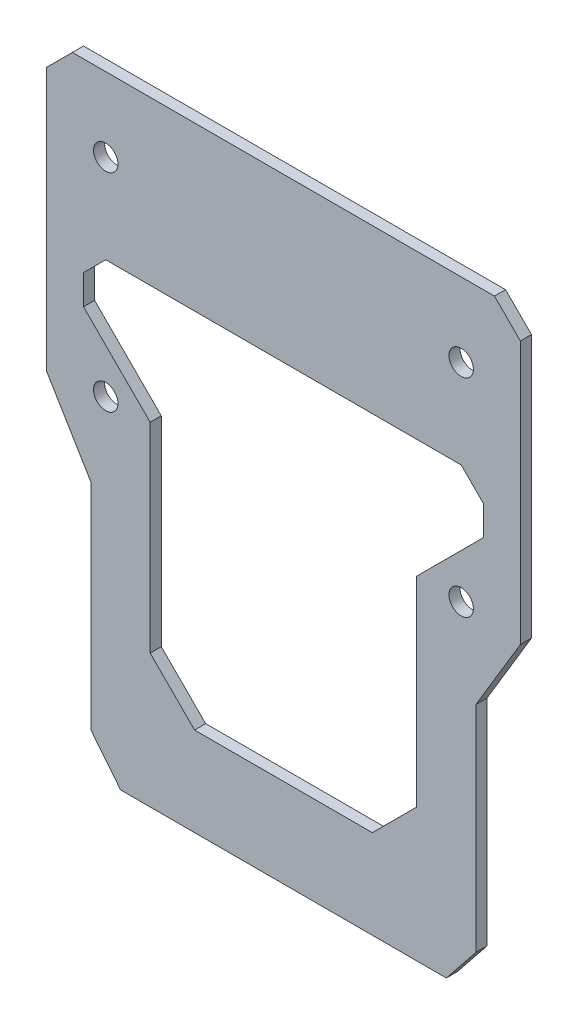
ISO-10303-21;
HEADER;
FILE_DESCRIPTION(('STEP AP214'),'2;1');
FILE_NAME('part.step','',(''),(''),'','','');
FILE_SCHEMA(('AUTOMOTIVE_DESIGN { 1 0 10303 214 1 1 1 1 }'));
ENDSEC;
DATA;
#1=APPLICATION_CONTEXT('core data for automotive mechanical design processes');
#2=APPLICATION_PROTOCOL_DEFINITION('international standard','automotive_design',2000,#1);
#3=PRODUCT_CONTEXT('',#1,'mechanical');
#4=PRODUCT('Part','Part','',(#3));
#5=PRODUCT_RELATED_PRODUCT_CATEGORY('part','',(#4));
#6=PRODUCT_DEFINITION_FORMATION('','',#4);
#7=PRODUCT_DEFINITION_CONTEXT('part definition',#1,'design');
#8=PRODUCT_DEFINITION('design','',#6,#7);
#9=PRODUCT_DEFINITION_SHAPE('','',#8);
#10=(LENGTH_UNIT() NAMED_UNIT(*) SI_UNIT(.MILLI.,.METRE.));
#11=(NAMED_UNIT(*) PLANE_ANGLE_UNIT() SI_UNIT($,.RADIAN.));
#12=(NAMED_UNIT(*) SI_UNIT($,.STERADIAN.) SOLID_ANGLE_UNIT());
#13=UNCERTAINTY_MEASURE_WITH_UNIT(LENGTH_MEASURE(1.E-05),#10,'distance_accuracy_value','');
#14=(GEOMETRIC_REPRESENTATION_CONTEXT(3) GLOBAL_UNCERTAINTY_ASSIGNED_CONTEXT((#13)) GLOBAL_UNIT_ASSIGNED_CONTEXT((#10,
#11,#12)) REPRESENTATION_CONTEXT('',''));
#15=CARTESIAN_POINT('',(0.,0.,0.));
#16=DIRECTION('',(0.,0.,1.));
#17=DIRECTION('',(1.,0.,0.));
#18=AXIS2_PLACEMENT_3D('',#15,#16,#17);
#19=CARTESIAN_POINT('',(0.,0.,1.5));
#20=DIRECTION('',(0.,0.,-1.));
#21=DIRECTION('',(-1.,0.,0.));
#22=AXIS2_PLACEMENT_3D('',#19,#20,#21);
#23=PLANE('',#22);
#24=CARTESIAN_POINT('',(24.,73.,1.5));
#25=DIRECTION('',(0.,0.,1.));
#26=DIRECTION('',(1.,0.,0.));
#27=AXIS2_PLACEMENT_3D('',#24,#25,#26);
#28=CIRCLE('',#27,1.65);
#29=CARTESIAN_POINT('',(25.65,73.,1.5));
#30=VERTEX_POINT('',#29);
#31=EDGE_CURVE('E550',#30,#30,#28,.T.);
#32=ORIENTED_EDGE('',*,*,#31,.F.);
#33=EDGE_LOOP('',(#32));
#34=FACE_BOUND('',#33,.T.);
#35=CARTESIAN_POINT('',(-24.,73.,1.5));
#36=DIRECTION('',(0.,0.,1.));
#37=DIRECTION('',(1.,0.,0.));
#38=AXIS2_PLACEMENT_3D('',#35,#36,#37);
#39=CIRCLE('',#38,1.65);
#40=CARTESIAN_POINT('',(-22.35,73.,1.5));
#41=VERTEX_POINT('',#40);
#42=EDGE_CURVE('E565',#41,#41,#39,.T.);
#43=ORIENTED_EDGE('',*,*,#42,.F.);
#44=EDGE_LOOP('',(#43));
#45=FACE_BOUND('',#44,.T.);
#46=CARTESIAN_POINT('',(24.,45.,1.5));
#47=DIRECTION('',(0.,0.,1.));
#48=DIRECTION('',(1.,0.,0.));
#49=AXIS2_PLACEMENT_3D('',#46,#47,#48);
#50=CIRCLE('',#49,1.65);
#51=CARTESIAN_POINT('',(25.65,45.,1.5));
#52=VERTEX_POINT('',#51);
#53=EDGE_CURVE('E574',#52,#52,#50,.T.);
#54=ORIENTED_EDGE('',*,*,#53,.F.);
#55=EDGE_LOOP('',(#54));
#56=FACE_BOUND('',#55,.T.);
#57=CARTESIAN_POINT('',(-24.,45.,1.5));
#58=DIRECTION('',(0.,0.,1.));
#59=DIRECTION('',(1.,0.,0.));
#60=AXIS2_PLACEMENT_3D('',#57,#58,#59);
#61=CIRCLE('',#60,1.65);
#62=CARTESIAN_POINT('',(-22.35,45.,1.5));
#63=VERTEX_POINT('',#62);
#64=EDGE_CURVE('E432',#63,#63,#61,.T.);
#65=ORIENTED_EDGE('',*,*,#64,.F.);
#66=EDGE_LOOP('',(#65));
#67=FACE_BOUND('',#66,.T.);
#68=DIRECTION('',(-0.707106781186548,-0.707106781186547,0.));
#69=VECTOR('',#68,1.);
#70=CARTESIAN_POINT('',(-27.,58.,1.5));
#71=LINE('',#70,#69);
#72=CARTESIAN_POINT('',(-24.,61.,1.5));
#73=VERTEX_POINT('',#72);
#74=CARTESIAN_POINT('',(-27.,58.,1.5));
#75=VERTEX_POINT('',#74);
#76=EDGE_CURVE('E399',#73,#75,#71,.T.);
#77=ORIENTED_EDGE('',*,*,#76,.F.);
#78=DIRECTION('',(-1.,0.,0.));
#79=VECTOR('',#78,1.);
#80=CARTESIAN_POINT('',(-24.,61.,1.5));
#81=LINE('',#80,#79);
#82=CARTESIAN_POINT('',(24.,61.,1.5));
#83=VERTEX_POINT('',#82);
#84=EDGE_CURVE('E418',#83,#73,#81,.T.);
#85=ORIENTED_EDGE('',*,*,#84,.F.);
#86=DIRECTION('',(-0.707106781186548,0.707106781186547,0.));
#87=VECTOR('',#86,1.);
#88=CARTESIAN_POINT('',(24.,61.,1.5));
#89=LINE('',#88,#87);
#90=CARTESIAN_POINT('',(27.,58.,1.5));
#91=VERTEX_POINT('',#90);
#92=EDGE_CURVE('E423',#91,#83,#89,.T.);
#93=ORIENTED_EDGE('',*,*,#92,.F.);
#94=DIRECTION('',(0.,1.,0.));
#95=VECTOR('',#94,1.);
#96=CARTESIAN_POINT('',(27.,58.,1.5));
#97=LINE('',#96,#95);
#98=CARTESIAN_POINT('',(27.,54.,1.5));
#99=VERTEX_POINT('',#98);
#100=EDGE_CURVE('E1009',#99,#91,#97,.T.);
#101=ORIENTED_EDGE('',*,*,#100,.F.);
#102=DIRECTION('',(0.707106781186547,0.707106781186547,0.));
#103=VECTOR('',#102,1.);
#104=CARTESIAN_POINT('',(27.,54.,1.5));
#105=LINE('',#104,#103);
#106=CARTESIAN_POINT('',(18.,45.,1.5));
#107=VERTEX_POINT('',#106);
#108=EDGE_CURVE('E1005',#107,#99,#105,.T.);
#109=ORIENTED_EDGE('',*,*,#108,.F.);
#110=DIRECTION('',(0.,1.,0.));
#111=VECTOR('',#110,1.);
#112=CARTESIAN_POINT('',(18.,45.,1.5));
#113=LINE('',#112,#111);
#114=CARTESIAN_POINT('',(18.,18.,1.5));
#115=VERTEX_POINT('',#114);
#116=EDGE_CURVE('E1001',#115,#107,#113,.T.);
#117=ORIENTED_EDGE('',*,*,#116,.F.);
#118=DIRECTION('',(0.707106781186548,0.707106781186548,0.));
#119=VECTOR('',#118,1.);
#120=CARTESIAN_POINT('',(18.,18.,1.5));
#121=LINE('',#120,#119);
#122=CARTESIAN_POINT('',(12.,12.,1.5));
#123=VERTEX_POINT('',#122);
#124=EDGE_CURVE('E1027',#123,#115,#121,.T.);
#125=ORIENTED_EDGE('',*,*,#124,.F.);
#126=DIRECTION('',(1.,0.,0.));
#127=VECTOR('',#126,1.);
#128=CARTESIAN_POINT('',(12.,12.,1.5));
#129=LINE('',#128,#127);
#130=CARTESIAN_POINT('',(-12.,12.,1.5));
#131=VERTEX_POINT('',#130);
#132=EDGE_CURVE('E994',#131,#123,#129,.T.);
#133=ORIENTED_EDGE('',*,*,#132,.F.);
#134=DIRECTION('',(0.707106781186548,-0.707106781186548,0.));
#135=VECTOR('',#134,1.);
#136=CARTESIAN_POINT('',(-12.,12.,1.5));
#137=LINE('',#136,#135);
#138=CARTESIAN_POINT('',(-18.,18.,1.5));
#139=VERTEX_POINT('',#138);
#140=EDGE_CURVE('E533',#139,#131,#137,.T.);
#141=ORIENTED_EDGE('',*,*,#140,.F.);
#142=DIRECTION('',(0.,-1.,0.));
#143=VECTOR('',#142,1.);
#144=CARTESIAN_POINT('',(-18.,18.,1.5));
#145=LINE('',#144,#143);
#146=CARTESIAN_POINT('',(-18.,45.,1.5));
#147=VERTEX_POINT('',#146);
#148=EDGE_CURVE('E530',#147,#139,#145,.T.);
#149=ORIENTED_EDGE('',*,*,#148,.F.);
#150=DIRECTION('',(0.707106781186547,-0.707106781186547,0.));
#151=VECTOR('',#150,1.);
#152=CARTESIAN_POINT('',(-18.,45.,1.5));
#153=LINE('',#152,#151);
#154=CARTESIAN_POINT('',(-27.,54.,1.5));
#155=VERTEX_POINT('',#154);
#156=EDGE_CURVE('E525',#155,#147,#153,.T.);
#157=ORIENTED_EDGE('',*,*,#156,.F.);
#158=DIRECTION('',(0.,-1.,0.));
#159=VECTOR('',#158,1.);
#160=CARTESIAN_POINT('',(-27.,54.,1.5));
#161=LINE('',#160,#159);
#162=EDGE_CURVE('E404',#75,#155,#161,.T.);
#163=ORIENTED_EDGE('',*,*,#162,.F.);
#164=EDGE_LOOP('',(#77,#85,#93,#101,#109,#117,#125,#133,#141,#149,#157,#163));
#165=FACE_BOUND('',#164,.T.);
#166=DIRECTION('',(1.,0.,0.));
#167=VECTOR('',#166,1.);
#168=CARTESIAN_POINT('',(-100.,83.,1.5));
#169=LINE('',#168,#167);
#170=CARTESIAN_POINT('',(-28.5,83.,1.5));
#171=VERTEX_POINT('',#170);
#172=CARTESIAN_POINT('',(28.5,83.,1.5));
#173=VERTEX_POINT('',#172);
#174=EDGE_CURVE('E211',#171,#173,#169,.T.);
#175=ORIENTED_EDGE('',*,*,#174,.F.);
#176=DIRECTION('',(-0.707106781186547,-0.707106781186548,0.));
#177=VECTOR('',#176,1.);
#178=CARTESIAN_POINT('',(-28.,83.5,1.5));
#179=LINE('',#178,#177);
#180=CARTESIAN_POINT('',(-32.,79.5,1.5));
#181=VERTEX_POINT('',#180);
#182=EDGE_CURVE('E346',#171,#181,#179,.T.);
#183=ORIENTED_EDGE('',*,*,#182,.T.);
#184=DIRECTION('',(0.,-1.,0.));
#185=VECTOR('',#184,1.);
#186=CARTESIAN_POINT('',(-32.,79.5,1.5));
#187=LINE('',#186,#185);
#188=CARTESIAN_POINT('',(-32.,44.,1.5));
#189=VERTEX_POINT('',#188);
#190=EDGE_CURVE('E387',#181,#189,#187,.T.);
#191=ORIENTED_EDGE('',*,*,#190,.T.);
#192=DIRECTION('',(0.514495755427527,-0.857492925712544,0.));
#193=VECTOR('',#192,1.);
#194=CARTESIAN_POINT('',(-32.,44.,1.5));
#195=LINE('',#194,#193);
#196=CARTESIAN_POINT('',(-26.,34.,1.5));
#197=VERTEX_POINT('',#196);
#198=EDGE_CURVE('E384',#189,#197,#195,.T.);
#199=ORIENTED_EDGE('',*,*,#198,.T.);
#200=DIRECTION('',(0.,-1.,0.));
#201=VECTOR('',#200,1.);
#202=CARTESIAN_POINT('',(-26.,34.,1.5));
#203=LINE('',#202,#201);
#204=CARTESIAN_POINT('',(-26.,5.,1.5));
#205=VERTEX_POINT('',#204);
#206=EDGE_CURVE('E260',#197,#205,#203,.T.);
#207=ORIENTED_EDGE('',*,*,#206,.T.);
#208=DIRECTION('',(0.624695047554424,-0.78086880944303,0.));
#209=VECTOR('',#208,1.);
#210=CARTESIAN_POINT('',(-26.,5.,1.5));
#211=LINE('',#210,#209);
#212=CARTESIAN_POINT('',(-22.,0.,1.5));
#213=VERTEX_POINT('',#212);
#214=EDGE_CURVE('E254',#205,#213,#211,.T.);
#215=ORIENTED_EDGE('',*,*,#214,.T.);
#216=DIRECTION('',(1.,0.,0.));
#217=VECTOR('',#216,1.);
#218=CARTESIAN_POINT('',(-22.,0.,1.5));
#219=LINE('',#218,#217);
#220=CARTESIAN_POINT('',(22.,0.,1.5));
#221=VERTEX_POINT('',#220);
#222=EDGE_CURVE('E299',#213,#221,#219,.T.);
#223=ORIENTED_EDGE('',*,*,#222,.T.);
#224=DIRECTION('',(0.624695047554424,0.78086880944303,0.));
#225=VECTOR('',#224,1.);
#226=CARTESIAN_POINT('',(22.,0.,1.5));
#227=LINE('',#226,#225);
#228=CARTESIAN_POINT('',(26.,5.,1.5));
#229=VERTEX_POINT('',#228);
#230=EDGE_CURVE('E365',#221,#229,#227,.T.);
#231=ORIENTED_EDGE('',*,*,#230,.T.);
#232=DIRECTION('',(0.,1.,0.));
#233=VECTOR('',#232,1.);
#234=CARTESIAN_POINT('',(26.,5.,1.5));
#235=LINE('',#234,#233);
#236=CARTESIAN_POINT('',(26.,34.,1.5));
#237=VERTEX_POINT('',#236);
#238=EDGE_CURVE('E347',#229,#237,#235,.T.);
#239=ORIENTED_EDGE('',*,*,#238,.T.);
#240=DIRECTION('',(0.514495755427527,0.857492925712544,0.));
#241=VECTOR('',#240,1.);
#242=CARTESIAN_POINT('',(26.,34.,1.5));
#243=LINE('',#242,#241);
#244=CARTESIAN_POINT('',(32.,44.,1.5));
#245=VERTEX_POINT('',#244);
#246=EDGE_CURVE('E341',#237,#245,#243,.T.);
#247=ORIENTED_EDGE('',*,*,#246,.T.);
#248=DIRECTION('',(0.,1.,0.));
#249=VECTOR('',#248,1.);
#250=CARTESIAN_POINT('',(32.,44.,1.5));
#251=LINE('',#250,#249);
#252=CARTESIAN_POINT('',(32.,79.5,1.5));
#253=VERTEX_POINT('',#252);
#254=EDGE_CURVE('E337',#245,#253,#251,.T.);
#255=ORIENTED_EDGE('',*,*,#254,.T.);
#256=DIRECTION('',(-0.707106781186547,0.707106781186548,0.));
#257=VECTOR('',#256,1.);
#258=CARTESIAN_POINT('',(32.,79.5,1.5));
#259=LINE('',#258,#257);
#260=EDGE_CURVE('E340',#253,#173,#259,.T.);
#261=ORIENTED_EDGE('',*,*,#260,.T.);
#262=EDGE_LOOP('',(#175,#183,#191,#199,#207,#215,#223,#231,#239,#247,#255,#261));
#263=FACE_BOUND('',#262,.T.);
#264=ADVANCED_FACE('F49',(#34,#45,#56,#67,#165,#263),#23,.F.);
#265=CARTESIAN_POINT('',(0.,0.,0.));
#266=DIRECTION('',(0.,0.,-1.));
#267=DIRECTION('',(-1.,0.,0.));
#268=AXIS2_PLACEMENT_3D('',#265,#266,#267);
#269=PLANE('',#268);
#270=CARTESIAN_POINT('',(-24.,73.,0.));
#271=DIRECTION('',(0.,0.,1.));
#272=DIRECTION('',(1.,0.,0.));
#273=AXIS2_PLACEMENT_3D('',#270,#271,#272);
#274=CIRCLE('',#273,1.65);
#275=CARTESIAN_POINT('',(-22.35,73.,0.));
#276=VERTEX_POINT('',#275);
#277=EDGE_CURVE('E555',#276,#276,#274,.T.);
#278=ORIENTED_EDGE('',*,*,#277,.T.);
#279=EDGE_LOOP('',(#278));
#280=FACE_BOUND('',#279,.T.);
#281=CARTESIAN_POINT('',(-24.,45.,0.));
#282=DIRECTION('',(0.,0.,1.));
#283=DIRECTION('',(1.,0.,0.));
#284=AXIS2_PLACEMENT_3D('',#281,#282,#283);
#285=CIRCLE('',#284,1.65);
#286=CARTESIAN_POINT('',(-22.35,45.,0.));
#287=VERTEX_POINT('',#286);
#288=EDGE_CURVE('E406',#287,#287,#285,.T.);
#289=ORIENTED_EDGE('',*,*,#288,.T.);
#290=EDGE_LOOP('',(#289));
#291=FACE_BOUND('',#290,.T.);
#292=DIRECTION('',(-1.,0.,0.));
#293=VECTOR('',#292,1.);
#294=CARTESIAN_POINT('',(-24.,61.,0.));
#295=LINE('',#294,#293);
#296=CARTESIAN_POINT('',(24.,61.,0.));
#297=VERTEX_POINT('',#296);
#298=CARTESIAN_POINT('',(-24.,61.,0.));
#299=VERTEX_POINT('',#298);
#300=EDGE_CURVE('E405',#297,#299,#295,.T.);
#301=ORIENTED_EDGE('',*,*,#300,.T.);
#302=DIRECTION('',(-0.707106781186548,-0.707106781186547,0.));
#303=VECTOR('',#302,1.);
#304=CARTESIAN_POINT('',(-27.,58.,0.));
#305=LINE('',#304,#303);
#306=CARTESIAN_POINT('',(-27.,58.,0.));
#307=VERTEX_POINT('',#306);
#308=EDGE_CURVE('E426',#299,#307,#305,.T.);
#309=ORIENTED_EDGE('',*,*,#308,.T.);
#310=DIRECTION('',(0.,-1.,0.));
#311=VECTOR('',#310,1.);
#312=CARTESIAN_POINT('',(-27.,54.,0.));
#313=LINE('',#312,#311);
#314=CARTESIAN_POINT('',(-27.,54.,0.));
#315=VERTEX_POINT('',#314);
#316=EDGE_CURVE('E431',#307,#315,#313,.T.);
#317=ORIENTED_EDGE('',*,*,#316,.T.);
#318=DIRECTION('',(0.707106781186547,-0.707106781186547,0.));
#319=VECTOR('',#318,1.);
#320=CARTESIAN_POINT('',(-18.,45.,0.));
#321=LINE('',#320,#319);
#322=CARTESIAN_POINT('',(-18.,45.,0.));
#323=VERTEX_POINT('',#322);
#324=EDGE_CURVE('E436',#315,#323,#321,.T.);
#325=ORIENTED_EDGE('',*,*,#324,.T.);
#326=DIRECTION('',(0.,-1.,0.));
#327=VECTOR('',#326,1.);
#328=CARTESIAN_POINT('',(-18.,18.,0.));
#329=LINE('',#328,#327);
#330=CARTESIAN_POINT('',(-18.,18.,0.));
#331=VERTEX_POINT('',#330);
#332=EDGE_CURVE('E440',#323,#331,#329,.T.);
#333=ORIENTED_EDGE('',*,*,#332,.T.);
#334=DIRECTION('',(0.707106781186548,-0.707106781186548,0.));
#335=VECTOR('',#334,1.);
#336=CARTESIAN_POINT('',(-12.,12.,0.));
#337=LINE('',#336,#335);
#338=CARTESIAN_POINT('',(-12.,12.,0.));
#339=VERTEX_POINT('',#338);
#340=EDGE_CURVE('E444',#331,#339,#337,.T.);
#341=ORIENTED_EDGE('',*,*,#340,.T.);
#342=DIRECTION('',(1.,0.,0.));
#343=VECTOR('',#342,1.);
#344=CARTESIAN_POINT('',(12.,12.,0.));
#345=LINE('',#344,#343);
#346=CARTESIAN_POINT('',(12.,12.,0.));
#347=VERTEX_POINT('',#346);
#348=EDGE_CURVE('E448',#339,#347,#345,.T.);
#349=ORIENTED_EDGE('',*,*,#348,.T.);
#350=DIRECTION('',(0.707106781186548,0.707106781186548,0.));
#351=VECTOR('',#350,1.);
#352=CARTESIAN_POINT('',(18.,18.,0.));
#353=LINE('',#352,#351);
#354=CARTESIAN_POINT('',(18.,18.,0.));
#355=VERTEX_POINT('',#354);
#356=EDGE_CURVE('E452',#347,#355,#353,.T.);
#357=ORIENTED_EDGE('',*,*,#356,.T.);
#358=DIRECTION('',(0.,1.,0.));
#359=VECTOR('',#358,1.);
#360=CARTESIAN_POINT('',(18.,45.,0.));
#361=LINE('',#360,#359);
#362=CARTESIAN_POINT('',(18.,45.,0.));
#363=VERTEX_POINT('',#362);
#364=EDGE_CURVE('E456',#355,#363,#361,.T.);
#365=ORIENTED_EDGE('',*,*,#364,.T.);
#366=DIRECTION('',(0.707106781186547,0.707106781186547,0.));
#367=VECTOR('',#366,1.);
#368=CARTESIAN_POINT('',(27.,54.,0.));
#369=LINE('',#368,#367);
#370=CARTESIAN_POINT('',(27.,54.,0.));
#371=VERTEX_POINT('',#370);
#372=EDGE_CURVE('E460',#363,#371,#369,.T.);
#373=ORIENTED_EDGE('',*,*,#372,.T.);
#374=DIRECTION('',(0.,1.,0.));
#375=VECTOR('',#374,1.);
#376=CARTESIAN_POINT('',(27.,58.,0.));
#377=LINE('',#376,#375);
#378=CARTESIAN_POINT('',(27.,58.,0.));
#379=VERTEX_POINT('',#378);
#380=EDGE_CURVE('E464',#371,#379,#377,.T.);
#381=ORIENTED_EDGE('',*,*,#380,.T.);
#382=DIRECTION('',(-0.707106781186548,0.707106781186547,0.));
#383=VECTOR('',#382,1.);
#384=CARTESIAN_POINT('',(24.,61.,0.));
#385=LINE('',#384,#383);
#386=EDGE_CURVE('E467',#379,#297,#385,.T.);
#387=ORIENTED_EDGE('',*,*,#386,.T.);
#388=EDGE_LOOP('',(#301,#309,#317,#325,#333,#341,#349,#357,#365,#373,#381,#387));
#389=FACE_BOUND('',#388,.T.);
#390=CARTESIAN_POINT('',(24.,45.,0.));
#391=DIRECTION('',(0.,0.,1.));
#392=DIRECTION('',(1.,0.,0.));
#393=AXIS2_PLACEMENT_3D('',#390,#391,#392);
#394=CIRCLE('',#393,1.65);
#395=CARTESIAN_POINT('',(25.65,45.,0.));
#396=VERTEX_POINT('',#395);
#397=EDGE_CURVE('E570',#396,#396,#394,.T.);
#398=ORIENTED_EDGE('',*,*,#397,.T.);
#399=EDGE_LOOP('',(#398));
#400=FACE_BOUND('',#399,.T.);
#401=CARTESIAN_POINT('',(24.,73.,0.));
#402=DIRECTION('',(0.,0.,1.));
#403=DIRECTION('',(1.,0.,0.));
#404=AXIS2_PLACEMENT_3D('',#401,#402,#403);
#405=CIRCLE('',#404,1.65);
#406=CARTESIAN_POINT('',(25.65,73.,0.));
#407=VERTEX_POINT('',#406);
#408=EDGE_CURVE('E217',#407,#407,#405,.T.);
#409=ORIENTED_EDGE('',*,*,#408,.T.);
#410=EDGE_LOOP('',(#409));
#411=FACE_BOUND('',#410,.T.);
#412=DIRECTION('',(-0.707106781186547,-0.707106781186548,0.));
#413=VECTOR('',#412,1.);
#414=CARTESIAN_POINT('',(-28.,83.5,0.));
#415=LINE('',#414,#413);
#416=CARTESIAN_POINT('',(-28.5,83.,0.));
#417=VERTEX_POINT('',#416);
#418=CARTESIAN_POINT('',(-32.,79.5,0.));
#419=VERTEX_POINT('',#418);
#420=EDGE_CURVE('E226',#417,#419,#415,.T.);
#421=ORIENTED_EDGE('',*,*,#420,.F.);
#422=DIRECTION('',(1.,0.,0.));
#423=VECTOR('',#422,1.);
#424=CARTESIAN_POINT('',(-100.,83.,0.));
#425=LINE('',#424,#423);
#426=CARTESIAN_POINT('',(28.5,83.,0.));
#427=VERTEX_POINT('',#426);
#428=EDGE_CURVE('E64',#417,#427,#425,.T.);
#429=ORIENTED_EDGE('',*,*,#428,.T.);
#430=DIRECTION('',(-0.707106781186547,0.707106781186548,0.));
#431=VECTOR('',#430,1.);
#432=CARTESIAN_POINT('',(32.,79.5,0.));
#433=LINE('',#432,#431);
#434=CARTESIAN_POINT('',(32.,79.5,0.));
#435=VERTEX_POINT('',#434);
#436=EDGE_CURVE('E224',#435,#427,#433,.T.);
#437=ORIENTED_EDGE('',*,*,#436,.F.);
#438=DIRECTION('',(0.,1.,0.));
#439=VECTOR('',#438,1.);
#440=CARTESIAN_POINT('',(32.,44.,0.));
#441=LINE('',#440,#439);
#442=CARTESIAN_POINT('',(32.,44.,0.));
#443=VERTEX_POINT('',#442);
#444=EDGE_CURVE('E234',#443,#435,#441,.T.);
#445=ORIENTED_EDGE('',*,*,#444,.F.);
#446=DIRECTION('',(0.514495755427527,0.857492925712544,0.));
#447=VECTOR('',#446,1.);
#448=CARTESIAN_POINT('',(26.,34.,0.));
#449=LINE('',#448,#447);
#450=CARTESIAN_POINT('',(26.,34.,0.));
#451=VERTEX_POINT('',#450);
#452=EDGE_CURVE('E242',#451,#443,#449,.T.);
#453=ORIENTED_EDGE('',*,*,#452,.F.);
#454=DIRECTION('',(0.,1.,0.));
#455=VECTOR('',#454,1.);
#456=CARTESIAN_POINT('',(26.,5.,0.));
#457=LINE('',#456,#455);
#458=CARTESIAN_POINT('',(26.,5.,0.));
#459=VERTEX_POINT('',#458);
#460=EDGE_CURVE('E323',#459,#451,#457,.T.);
#461=ORIENTED_EDGE('',*,*,#460,.F.);
#462=DIRECTION('',(0.624695047554424,0.78086880944303,0.));
#463=VECTOR('',#462,1.);
#464=CARTESIAN_POINT('',(22.,0.,0.));
#465=LINE('',#464,#463);
#466=CARTESIAN_POINT('',(22.,0.,0.));
#467=VERTEX_POINT('',#466);
#468=EDGE_CURVE('E311',#467,#459,#465,.T.);
#469=ORIENTED_EDGE('',*,*,#468,.F.);
#470=DIRECTION('',(1.,0.,0.));
#471=VECTOR('',#470,1.);
#472=CARTESIAN_POINT('',(-22.,0.,0.));
#473=LINE('',#472,#471);
#474=CARTESIAN_POINT('',(-22.,0.,0.));
#475=VERTEX_POINT('',#474);
#476=EDGE_CURVE('E298',#475,#467,#473,.T.);
#477=ORIENTED_EDGE('',*,*,#476,.F.);
#478=DIRECTION('',(0.624695047554424,-0.78086880944303,0.));
#479=VECTOR('',#478,1.);
#480=CARTESIAN_POINT('',(-26.,5.,0.));
#481=LINE('',#480,#479);
#482=CARTESIAN_POINT('',(-26.,5.,0.));
#483=VERTEX_POINT('',#482);
#484=EDGE_CURVE('E304',#483,#475,#481,.T.);
#485=ORIENTED_EDGE('',*,*,#484,.F.);
#486=DIRECTION('',(0.,-1.,0.));
#487=VECTOR('',#486,1.);
#488=CARTESIAN_POINT('',(-26.,34.,0.));
#489=LINE('',#488,#487);
#490=CARTESIAN_POINT('',(-26.,34.,0.));
#491=VERTEX_POINT('',#490);
#492=EDGE_CURVE('E251',#491,#483,#489,.T.);
#493=ORIENTED_EDGE('',*,*,#492,.F.);
#494=DIRECTION('',(0.514495755427527,-0.857492925712544,0.));
#495=VECTOR('',#494,1.);
#496=CARTESIAN_POINT('',(-32.,44.,0.));
#497=LINE('',#496,#495);
#498=CARTESIAN_POINT('',(-32.,44.,0.));
#499=VERTEX_POINT('',#498);
#500=EDGE_CURVE('E248',#499,#491,#497,.T.);
#501=ORIENTED_EDGE('',*,*,#500,.F.);
#502=DIRECTION('',(0.,-1.,0.));
#503=VECTOR('',#502,1.);
#504=CARTESIAN_POINT('',(-32.,79.5,0.));
#505=LINE('',#504,#503);
#506=EDGE_CURVE('E239',#419,#499,#505,.T.);
#507=ORIENTED_EDGE('',*,*,#506,.F.);
#508=EDGE_LOOP('',(#421,#429,#437,#445,#453,#461,#469,#477,#485,#493,#501,#507));
#509=FACE_BOUND('',#508,.T.);
#510=ADVANCED_FACE('F222',(#280,#291,#389,#400,#411,#509),#269,.T.);
#511=CARTESIAN_POINT('',(32.,79.5,1.5));
#512=DIRECTION('',(-0.707106781186548,-0.707106781186547,0.));
#513=DIRECTION('',(0.707106781186547,-0.707106781186548,0.));
#514=AXIS2_PLACEMENT_3D('',#511,#512,#513);
#515=PLANE('',#514);
#516=DIRECTION('',(0.,0.,-1.));
#517=VECTOR('',#516,1.);
#518=CARTESIAN_POINT('',(28.5,83.,1.5));
#519=LINE('',#518,#517);
#520=EDGE_CURVE('E208',#173,#427,#519,.T.);
#521=ORIENTED_EDGE('',*,*,#520,.F.);
#522=ORIENTED_EDGE('',*,*,#260,.F.);
#523=DIRECTION('',(0.,0.,-1.));
#524=VECTOR('',#523,1.);
#525=CARTESIAN_POINT('',(32.,79.5,1.5));
#526=LINE('',#525,#524);
#527=EDGE_CURVE('E232',#253,#435,#526,.T.);
#528=ORIENTED_EDGE('',*,*,#527,.T.);
#529=ORIENTED_EDGE('',*,*,#436,.T.);
#530=EDGE_LOOP('',(#521,#522,#528,#529));
#531=FACE_BOUND('',#530,.T.);
#532=ADVANCED_FACE('F230',(#531),#515,.F.);
#533=CARTESIAN_POINT('',(-28.,83.5,1.5));
#534=DIRECTION('',(0.707106781186548,-0.707106781186547,0.));
#535=DIRECTION('',(0.707106781186547,0.707106781186548,0.));
#536=AXIS2_PLACEMENT_3D('',#533,#534,#535);
#537=PLANE('',#536);
#538=DIRECTION('',(0.,0.,1.));
#539=VECTOR('',#538,1.);
#540=CARTESIAN_POINT('',(-28.5,83.,1.5));
#541=LINE('',#540,#539);
#542=EDGE_CURVE('E12',#417,#171,#541,.T.);
#543=ORIENTED_EDGE('',*,*,#542,.F.);
#544=ORIENTED_EDGE('',*,*,#420,.T.);
#545=DIRECTION('',(0.,0.,-1.));
#546=VECTOR('',#545,1.);
#547=CARTESIAN_POINT('',(-32.,79.5,1.5));
#548=LINE('',#547,#546);
#549=EDGE_CURVE('E268',#181,#419,#548,.T.);
#550=ORIENTED_EDGE('',*,*,#549,.F.);
#551=ORIENTED_EDGE('',*,*,#182,.F.);
#552=EDGE_LOOP('',(#543,#544,#550,#551));
#553=FACE_BOUND('',#552,.T.);
#554=ADVANCED_FACE('F632',(#553),#537,.F.);
#555=CARTESIAN_POINT('',(-26.,5.,1.5));
#556=DIRECTION('',(0.78086880944303,0.624695047554424,0.));
#557=DIRECTION('',(-0.624695047554424,0.78086880944303,0.));
#558=AXIS2_PLACEMENT_3D('',#555,#556,#557);
#559=PLANE('',#558);
#560=ORIENTED_EDGE('',*,*,#484,.T.);
#561=DIRECTION('',(0.,0.,-1.));
#562=VECTOR('',#561,1.);
#563=CARTESIAN_POINT('',(-22.,0.,1.5));
#564=LINE('',#563,#562);
#565=EDGE_CURVE('E58',#213,#475,#564,.T.);
#566=ORIENTED_EDGE('',*,*,#565,.F.);
#567=ORIENTED_EDGE('',*,*,#214,.F.);
#568=DIRECTION('',(0.,0.,-1.));
#569=VECTOR('',#568,1.);
#570=CARTESIAN_POINT('',(-26.,5.,1.5));
#571=LINE('',#570,#569);
#572=EDGE_CURVE('E255',#205,#483,#571,.T.);
#573=ORIENTED_EDGE('',*,*,#572,.T.);
#574=EDGE_LOOP('',(#560,#566,#567,#573));
#575=FACE_BOUND('',#574,.T.);
#576=ADVANCED_FACE('F51',(#575),#559,.F.);
#577=CARTESIAN_POINT('',(-22.,0.,1.5));
#578=DIRECTION('',(0.,1.,0.));
#579=DIRECTION('',(0.,0.,1.));
#580=AXIS2_PLACEMENT_3D('',#577,#578,#579);
#581=PLANE('',#580);
#582=ORIENTED_EDGE('',*,*,#476,.T.);
#583=DIRECTION('',(0.,0.,-1.));
#584=VECTOR('',#583,1.);
#585=CARTESIAN_POINT('',(22.,0.,1.5));
#586=LINE('',#585,#584);
#587=EDGE_CURVE('E286',#221,#467,#586,.T.);
#588=ORIENTED_EDGE('',*,*,#587,.F.);
#589=ORIENTED_EDGE('',*,*,#222,.F.);
#590=ORIENTED_EDGE('',*,*,#565,.T.);
#591=EDGE_LOOP('',(#582,#588,#589,#590));
#592=FACE_BOUND('',#591,.T.);
#593=ADVANCED_FACE('F296',(#592),#581,.F.);
#594=CARTESIAN_POINT('',(22.,0.,1.5));
#595=DIRECTION('',(-0.78086880944303,0.624695047554424,0.));
#596=DIRECTION('',(-0.624695047554424,-0.78086880944303,0.));
#597=AXIS2_PLACEMENT_3D('',#594,#595,#596);
#598=PLANE('',#597);
#599=ORIENTED_EDGE('',*,*,#468,.T.);
#600=DIRECTION('',(0.,0.,-1.));
#601=VECTOR('',#600,1.);
#602=CARTESIAN_POINT('',(26.,5.,1.5));
#603=LINE('',#602,#601);
#604=EDGE_CURVE('E282',#229,#459,#603,.T.);
#605=ORIENTED_EDGE('',*,*,#604,.F.);
#606=ORIENTED_EDGE('',*,*,#230,.F.);
#607=ORIENTED_EDGE('',*,*,#587,.T.);
#608=EDGE_LOOP('',(#599,#605,#606,#607));
#609=FACE_BOUND('',#608,.T.);
#610=ADVANCED_FACE('F645',(#609),#598,.F.);
#611=CARTESIAN_POINT('',(26.,5.,1.5));
#612=DIRECTION('',(-1.,0.,0.));
#613=DIRECTION('',(0.,0.,1.));
#614=AXIS2_PLACEMENT_3D('',#611,#612,#613);
#615=PLANE('',#614);
#616=ORIENTED_EDGE('',*,*,#460,.T.);
#617=DIRECTION('',(0.,0.,-1.));
#618=VECTOR('',#617,1.);
#619=CARTESIAN_POINT('',(26.,34.,1.5));
#620=LINE('',#619,#618);
#621=EDGE_CURVE('E278',#237,#451,#620,.T.);
#622=ORIENTED_EDGE('',*,*,#621,.F.);
#623=ORIENTED_EDGE('',*,*,#238,.F.);
#624=ORIENTED_EDGE('',*,*,#604,.T.);
#625=EDGE_LOOP('',(#616,#622,#623,#624));
#626=FACE_BOUND('',#625,.T.);
#627=ADVANCED_FACE('F642',(#626),#615,.F.);
#628=CARTESIAN_POINT('',(26.,34.,1.5));
#629=DIRECTION('',(-0.857492925712544,0.514495755427527,0.));
#630=DIRECTION('',(-0.514495755427527,-0.857492925712544,0.));
#631=AXIS2_PLACEMENT_3D('',#628,#629,#630);
#632=PLANE('',#631);
#633=ORIENTED_EDGE('',*,*,#452,.T.);
#634=DIRECTION('',(0.,0.,-1.));
#635=VECTOR('',#634,1.);
#636=CARTESIAN_POINT('',(32.,44.,1.5));
#637=LINE('',#636,#635);
#638=EDGE_CURVE('E274',#245,#443,#637,.T.);
#639=ORIENTED_EDGE('',*,*,#638,.F.);
#640=ORIENTED_EDGE('',*,*,#246,.F.);
#641=ORIENTED_EDGE('',*,*,#621,.T.);
#642=EDGE_LOOP('',(#633,#639,#640,#641));
#643=FACE_BOUND('',#642,.T.);
#644=ADVANCED_FACE('F330',(#643),#632,.F.);
#645=CARTESIAN_POINT('',(32.,44.,1.5));
#646=DIRECTION('',(-1.,0.,0.));
#647=DIRECTION('',(0.,0.,1.));
#648=AXIS2_PLACEMENT_3D('',#645,#646,#647);
#649=PLANE('',#648);
#650=ORIENTED_EDGE('',*,*,#444,.T.);
#651=ORIENTED_EDGE('',*,*,#527,.F.);
#652=ORIENTED_EDGE('',*,*,#254,.F.);
#653=ORIENTED_EDGE('',*,*,#638,.T.);
#654=EDGE_LOOP('',(#650,#651,#652,#653));
#655=FACE_BOUND('',#654,.T.);
#656=ADVANCED_FACE('F336',(#655),#649,.F.);
#657=CARTESIAN_POINT('',(-32.,79.5,1.5));
#658=DIRECTION('',(1.,0.,0.));
#659=DIRECTION('',(0.,0.,-1.));
#660=AXIS2_PLACEMENT_3D('',#657,#658,#659);
#661=PLANE('',#660);
#662=ORIENTED_EDGE('',*,*,#506,.T.);
#663=DIRECTION('',(0.,0.,-1.));
#664=VECTOR('',#663,1.);
#665=CARTESIAN_POINT('',(-32.,44.,1.5));
#666=LINE('',#665,#664);
#667=EDGE_CURVE('E264',#189,#499,#666,.T.);
#668=ORIENTED_EDGE('',*,*,#667,.F.);
#669=ORIENTED_EDGE('',*,*,#190,.F.);
#670=ORIENTED_EDGE('',*,*,#549,.T.);
#671=EDGE_LOOP('',(#662,#668,#669,#670));
#672=FACE_BOUND('',#671,.T.);
#673=ADVANCED_FACE('F627',(#672),#661,.F.);
#674=CARTESIAN_POINT('',(-32.,44.,1.5));
#675=DIRECTION('',(0.857492925712544,0.514495755427527,0.));
#676=DIRECTION('',(-0.514495755427527,0.857492925712544,0.));
#677=AXIS2_PLACEMENT_3D('',#674,#675,#676);
#678=PLANE('',#677);
#679=ORIENTED_EDGE('',*,*,#500,.T.);
#680=DIRECTION('',(0.,0.,-1.));
#681=VECTOR('',#680,1.);
#682=CARTESIAN_POINT('',(-26.,34.,1.5));
#683=LINE('',#682,#681);
#684=EDGE_CURVE('E259',#197,#491,#683,.T.);
#685=ORIENTED_EDGE('',*,*,#684,.F.);
#686=ORIENTED_EDGE('',*,*,#198,.F.);
#687=ORIENTED_EDGE('',*,*,#667,.T.);
#688=EDGE_LOOP('',(#679,#685,#686,#687));
#689=FACE_BOUND('',#688,.T.);
#690=ADVANCED_FACE('F623',(#689),#678,.F.);
#691=CARTESIAN_POINT('',(-26.,34.,1.5));
#692=DIRECTION('',(1.,0.,0.));
#693=DIRECTION('',(0.,0.,-1.));
#694=AXIS2_PLACEMENT_3D('',#691,#692,#693);
#695=PLANE('',#694);
#696=ORIENTED_EDGE('',*,*,#492,.T.);
#697=ORIENTED_EDGE('',*,*,#572,.F.);
#698=ORIENTED_EDGE('',*,*,#206,.F.);
#699=ORIENTED_EDGE('',*,*,#684,.T.);
#700=EDGE_LOOP('',(#696,#697,#698,#699));
#701=FACE_BOUND('',#700,.T.);
#702=ADVANCED_FACE('F620',(#701),#695,.F.);
#703=CARTESIAN_POINT('',(-27.,58.,1.5));
#704=DIRECTION('',(0.707106781186547,-0.707106781186548,0.));
#705=DIRECTION('',(0.707106781186548,0.707106781186547,0.));
#706=AXIS2_PLACEMENT_3D('',#703,#704,#705);
#707=PLANE('',#706);
#708=ORIENTED_EDGE('',*,*,#308,.F.);
#709=DIRECTION('',(0.,0.,-1.));
#710=VECTOR('',#709,1.);
#711=CARTESIAN_POINT('',(-24.,61.,1.5));
#712=LINE('',#711,#710);
#713=EDGE_CURVE('E422',#73,#299,#712,.T.);
#714=ORIENTED_EDGE('',*,*,#713,.F.);
#715=ORIENTED_EDGE('',*,*,#76,.T.);
#716=DIRECTION('',(0.,0.,-1.));
#717=VECTOR('',#716,1.);
#718=CARTESIAN_POINT('',(-27.,58.,1.5));
#719=LINE('',#718,#717);
#720=EDGE_CURVE('E308',#75,#307,#719,.T.);
#721=ORIENTED_EDGE('',*,*,#720,.T.);
#722=EDGE_LOOP('',(#708,#714,#715,#721));
#723=FACE_BOUND('',#722,.T.);
#724=ADVANCED_FACE('F517',(#723),#707,.T.);
#725=CARTESIAN_POINT('',(-27.,54.,1.5));
#726=DIRECTION('',(1.,0.,0.));
#727=DIRECTION('',(0.,0.,-1.));
#728=AXIS2_PLACEMENT_3D('',#725,#726,#727);
#729=PLANE('',#728);
#730=ORIENTED_EDGE('',*,*,#316,.F.);
#731=ORIENTED_EDGE('',*,*,#720,.F.);
#732=ORIENTED_EDGE('',*,*,#162,.T.);
#733=DIRECTION('',(0.,0.,-1.));
#734=VECTOR('',#733,1.);
#735=CARTESIAN_POINT('',(-27.,54.,1.5));
#736=LINE('',#735,#734);
#737=EDGE_CURVE('E315',#155,#315,#736,.T.);
#738=ORIENTED_EDGE('',*,*,#737,.T.);
#739=EDGE_LOOP('',(#730,#731,#732,#738));
#740=FACE_BOUND('',#739,.T.);
#741=ADVANCED_FACE('F505',(#740),#729,.T.);
#742=CARTESIAN_POINT('',(-18.,45.,1.5));
#743=DIRECTION('',(0.707106781186548,0.707106781186548,0.));
#744=DIRECTION('',(-0.707106781186548,0.707106781186548,0.));
#745=AXIS2_PLACEMENT_3D('',#742,#743,#744);
#746=PLANE('',#745);
#747=ORIENTED_EDGE('',*,*,#324,.F.);
#748=ORIENTED_EDGE('',*,*,#737,.F.);
#749=ORIENTED_EDGE('',*,*,#156,.T.);
#750=DIRECTION('',(0.,0.,-1.));
#751=VECTOR('',#750,1.);
#752=CARTESIAN_POINT('',(-18.,45.,1.5));
#753=LINE('',#752,#751);
#754=EDGE_CURVE('E498',#147,#323,#753,.T.);
#755=ORIENTED_EDGE('',*,*,#754,.T.);
#756=EDGE_LOOP('',(#747,#748,#749,#755));
#757=FACE_BOUND('',#756,.T.);
#758=ADVANCED_FACE('F510',(#757),#746,.T.);
#759=CARTESIAN_POINT('',(-18.,18.,1.5));
#760=DIRECTION('',(1.,0.,0.));
#761=DIRECTION('',(0.,0.,-1.));
#762=AXIS2_PLACEMENT_3D('',#759,#760,#761);
#763=PLANE('',#762);
#764=ORIENTED_EDGE('',*,*,#332,.F.);
#765=ORIENTED_EDGE('',*,*,#754,.F.);
#766=ORIENTED_EDGE('',*,*,#148,.T.);
#767=DIRECTION('',(0.,0.,-1.));
#768=VECTOR('',#767,1.);
#769=CARTESIAN_POINT('',(-18.,18.,1.5));
#770=LINE('',#769,#768);
#771=EDGE_CURVE('E495',#139,#331,#770,.T.);
#772=ORIENTED_EDGE('',*,*,#771,.T.);
#773=EDGE_LOOP('',(#764,#765,#766,#772));
#774=FACE_BOUND('',#773,.T.);
#775=ADVANCED_FACE('F787',(#774),#763,.T.);
#776=CARTESIAN_POINT('',(-12.,12.,1.5));
#777=DIRECTION('',(0.707106781186547,0.707106781186547,0.));
#778=DIRECTION('',(-0.707106781186548,0.707106781186548,0.));
#779=AXIS2_PLACEMENT_3D('',#776,#777,#778);
#780=PLANE('',#779);
#781=ORIENTED_EDGE('',*,*,#340,.F.);
#782=ORIENTED_EDGE('',*,*,#771,.F.);
#783=ORIENTED_EDGE('',*,*,#140,.T.);
#784=DIRECTION('',(0.,0.,-1.));
#785=VECTOR('',#784,1.);
#786=CARTESIAN_POINT('',(-12.,12.,1.5));
#787=LINE('',#786,#785);
#788=EDGE_CURVE('E492',#131,#339,#787,.T.);
#789=ORIENTED_EDGE('',*,*,#788,.T.);
#790=EDGE_LOOP('',(#781,#782,#783,#789));
#791=FACE_BOUND('',#790,.T.);
#792=ADVANCED_FACE('F778',(#791),#780,.T.);
#793=CARTESIAN_POINT('',(12.,12.,1.5));
#794=DIRECTION('',(0.,1.,0.));
#795=DIRECTION('',(0.,0.,1.));
#796=AXIS2_PLACEMENT_3D('',#793,#794,#795);
#797=PLANE('',#796);
#798=ORIENTED_EDGE('',*,*,#348,.F.);
#799=ORIENTED_EDGE('',*,*,#788,.F.);
#800=ORIENTED_EDGE('',*,*,#132,.T.);
#801=DIRECTION('',(0.,0.,-1.));
#802=VECTOR('',#801,1.);
#803=CARTESIAN_POINT('',(12.,12.,1.5));
#804=LINE('',#803,#802);
#805=EDGE_CURVE('E489',#123,#347,#804,.T.);
#806=ORIENTED_EDGE('',*,*,#805,.T.);
#807=EDGE_LOOP('',(#798,#799,#800,#806));
#808=FACE_BOUND('',#807,.T.);
#809=ADVANCED_FACE('F769',(#808),#797,.T.);
#810=CARTESIAN_POINT('',(18.,18.,1.5));
#811=DIRECTION('',(-0.707106781186547,0.707106781186547,0.));
#812=DIRECTION('',(-0.707106781186548,-0.707106781186548,0.));
#813=AXIS2_PLACEMENT_3D('',#810,#811,#812);
#814=PLANE('',#813);
#815=ORIENTED_EDGE('',*,*,#356,.F.);
#816=ORIENTED_EDGE('',*,*,#805,.F.);
#817=ORIENTED_EDGE('',*,*,#124,.T.);
#818=DIRECTION('',(0.,0.,-1.));
#819=VECTOR('',#818,1.);
#820=CARTESIAN_POINT('',(18.,18.,1.5));
#821=LINE('',#820,#819);
#822=EDGE_CURVE('E486',#115,#355,#821,.T.);
#823=ORIENTED_EDGE('',*,*,#822,.T.);
#824=EDGE_LOOP('',(#815,#816,#817,#823));
#825=FACE_BOUND('',#824,.T.);
#826=ADVANCED_FACE('F760',(#825),#814,.T.);
#827=CARTESIAN_POINT('',(18.,45.,1.5));
#828=DIRECTION('',(-1.,0.,0.));
#829=DIRECTION('',(0.,0.,1.));
#830=AXIS2_PLACEMENT_3D('',#827,#828,#829);
#831=PLANE('',#830);
#832=ORIENTED_EDGE('',*,*,#364,.F.);
#833=ORIENTED_EDGE('',*,*,#822,.F.);
#834=ORIENTED_EDGE('',*,*,#116,.T.);
#835=DIRECTION('',(0.,0.,-1.));
#836=VECTOR('',#835,1.);
#837=CARTESIAN_POINT('',(18.,45.,1.5));
#838=LINE('',#837,#836);
#839=EDGE_CURVE('E484',#107,#363,#838,.T.);
#840=ORIENTED_EDGE('',*,*,#839,.T.);
#841=EDGE_LOOP('',(#832,#833,#834,#840));
#842=FACE_BOUND('',#841,.T.);
#843=ADVANCED_FACE('F751',(#842),#831,.T.);
#844=CARTESIAN_POINT('',(27.,54.,1.5));
#845=DIRECTION('',(-0.707106781186548,0.707106781186548,0.));
#846=DIRECTION('',(-0.707106781186548,-0.707106781186548,0.));
#847=AXIS2_PLACEMENT_3D('',#844,#845,#846);
#848=PLANE('',#847);
#849=ORIENTED_EDGE('',*,*,#372,.F.);
#850=ORIENTED_EDGE('',*,*,#839,.F.);
#851=ORIENTED_EDGE('',*,*,#108,.T.);
#852=DIRECTION('',(0.,0.,-1.));
#853=VECTOR('',#852,1.);
#854=CARTESIAN_POINT('',(27.,54.,1.5));
#855=LINE('',#854,#853);
#856=EDGE_CURVE('E481',#99,#371,#855,.T.);
#857=ORIENTED_EDGE('',*,*,#856,.T.);
#858=EDGE_LOOP('',(#849,#850,#851,#857));
#859=FACE_BOUND('',#858,.T.);
#860=ADVANCED_FACE('F742',(#859),#848,.T.);
#861=CARTESIAN_POINT('',(27.,58.,1.5));
#862=DIRECTION('',(-1.,0.,0.));
#863=DIRECTION('',(0.,0.,1.));
#864=AXIS2_PLACEMENT_3D('',#861,#862,#863);
#865=PLANE('',#864);
#866=ORIENTED_EDGE('',*,*,#380,.F.);
#867=ORIENTED_EDGE('',*,*,#856,.F.);
#868=ORIENTED_EDGE('',*,*,#100,.T.);
#869=DIRECTION('',(0.,0.,-1.));
#870=VECTOR('',#869,1.);
#871=CARTESIAN_POINT('',(27.,58.,1.5));
#872=LINE('',#871,#870);
#873=EDGE_CURVE('E478',#91,#379,#872,.T.);
#874=ORIENTED_EDGE('',*,*,#873,.T.);
#875=EDGE_LOOP('',(#866,#867,#868,#874));
#876=FACE_BOUND('',#875,.T.);
#877=ADVANCED_FACE('F733',(#876),#865,.T.);
#878=CARTESIAN_POINT('',(24.,61.,1.5));
#879=DIRECTION('',(-0.707106781186547,-0.707106781186548,0.));
#880=DIRECTION('',(0.707106781186548,-0.707106781186547,0.));
#881=AXIS2_PLACEMENT_3D('',#878,#879,#880);
#882=PLANE('',#881);
#883=ORIENTED_EDGE('',*,*,#386,.F.);
#884=ORIENTED_EDGE('',*,*,#873,.F.);
#885=ORIENTED_EDGE('',*,*,#92,.T.);
#886=DIRECTION('',(0.,0.,-1.));
#887=VECTOR('',#886,1.);
#888=CARTESIAN_POINT('',(24.,61.,1.5));
#889=LINE('',#888,#887);
#890=EDGE_CURVE('E72',#83,#297,#889,.T.);
#891=ORIENTED_EDGE('',*,*,#890,.T.);
#892=EDGE_LOOP('',(#883,#884,#885,#891));
#893=FACE_BOUND('',#892,.T.);
#894=ADVANCED_FACE('F605',(#893),#882,.T.);
#895=CARTESIAN_POINT('',(-24.,61.,1.5));
#896=DIRECTION('',(0.,-1.,0.));
#897=DIRECTION('',(0.,0.,-1.));
#898=AXIS2_PLACEMENT_3D('',#895,#896,#897);
#899=PLANE('',#898);
#900=ORIENTED_EDGE('',*,*,#300,.F.);
#901=ORIENTED_EDGE('',*,*,#890,.F.);
#902=ORIENTED_EDGE('',*,*,#84,.T.);
#903=ORIENTED_EDGE('',*,*,#713,.T.);
#904=EDGE_LOOP('',(#900,#901,#902,#903));
#905=FACE_BOUND('',#904,.T.);
#906=ADVANCED_FACE('F519',(#905),#899,.T.);
#907=CARTESIAN_POINT('',(-24.,45.,1.5));
#908=DIRECTION('',(0.,0.,-1.));
#909=DIRECTION('',(-1.,0.,0.));
#910=AXIS2_PLACEMENT_3D('',#907,#908,#909);
#911=CYLINDRICAL_SURFACE('',#910,1.65);
#912=ORIENTED_EDGE('',*,*,#64,.T.);
#913=EDGE_LOOP('',(#912));
#914=FACE_BOUND('',#913,.T.);
#915=ORIENTED_EDGE('',*,*,#288,.F.);
#916=EDGE_LOOP('',(#915));
#917=FACE_BOUND('',#916,.T.);
#918=ADVANCED_FACE('F594',(#914,#917),#911,.F.);
#919=CARTESIAN_POINT('',(24.,45.,1.5));
#920=DIRECTION('',(0.,0.,-1.));
#921=DIRECTION('',(-1.,0.,0.));
#922=AXIS2_PLACEMENT_3D('',#919,#920,#921);
#923=CYLINDRICAL_SURFACE('',#922,1.65);
#924=ORIENTED_EDGE('',*,*,#53,.T.);
#925=EDGE_LOOP('',(#924));
#926=FACE_BOUND('',#925,.T.);
#927=ORIENTED_EDGE('',*,*,#397,.F.);
#928=EDGE_LOOP('',(#927));
#929=FACE_BOUND('',#928,.T.);
#930=ADVANCED_FACE('F596',(#926,#929),#923,.F.);
#931=CARTESIAN_POINT('',(-24.,73.,1.5));
#932=DIRECTION('',(0.,0.,-1.));
#933=DIRECTION('',(-1.,0.,0.));
#934=AXIS2_PLACEMENT_3D('',#931,#932,#933);
#935=CYLINDRICAL_SURFACE('',#934,1.65);
#936=ORIENTED_EDGE('',*,*,#42,.T.);
#937=EDGE_LOOP('',(#936));
#938=FACE_BOUND('',#937,.T.);
#939=ORIENTED_EDGE('',*,*,#277,.F.);
#940=EDGE_LOOP('',(#939));
#941=FACE_BOUND('',#940,.T.);
#942=ADVANCED_FACE('F602',(#938,#941),#935,.F.);
#943=CARTESIAN_POINT('',(24.,73.,1.5));
#944=DIRECTION('',(0.,0.,-1.));
#945=DIRECTION('',(-1.,0.,0.));
#946=AXIS2_PLACEMENT_3D('',#943,#944,#945);
#947=CYLINDRICAL_SURFACE('',#946,1.65);
#948=ORIENTED_EDGE('',*,*,#31,.T.);
#949=EDGE_LOOP('',(#948));
#950=FACE_BOUND('',#949,.T.);
#951=ORIENTED_EDGE('',*,*,#408,.F.);
#952=EDGE_LOOP('',(#951));
#953=FACE_BOUND('',#952,.T.);
#954=ADVANCED_FACE('F675',(#950,#953),#947,.F.);
#955=CARTESIAN_POINT('',(-100.,83.,1.5));
#956=DIRECTION('',(0.,1.,0.));
#957=DIRECTION('',(0.,0.,1.));
#958=AXIS2_PLACEMENT_3D('',#955,#956,#957);
#959=PLANE('',#958);
#960=ORIENTED_EDGE('',*,*,#520,.T.);
#961=ORIENTED_EDGE('',*,*,#428,.F.);
#962=ORIENTED_EDGE('',*,*,#542,.T.);
#963=ORIENTED_EDGE('',*,*,#174,.T.);
#964=EDGE_LOOP('',(#960,#961,#962,#963));
#965=FACE_BOUND('',#964,.T.);
#966=ADVANCED_FACE('F209',(#965),#959,.T.);
#967=CLOSED_SHELL('',(#264,#510,#532,#554,#576,#593,#610,#627,#644,#656,#673,#690,#702,#724,
#741,#758,#775,#792,#809,#826,#843,#860,#877,#894,#906,#918,#930,#942,#954,#966));
#968=MANIFOLD_SOLID_BREP('B2',#967);
#969=ADVANCED_BREP_SHAPE_REPRESENTATION('',(#18,#968),#14);
#970=SHAPE_DEFINITION_REPRESENTATION(#9,#969);
ENDSEC;
END-ISO-10303-21;
